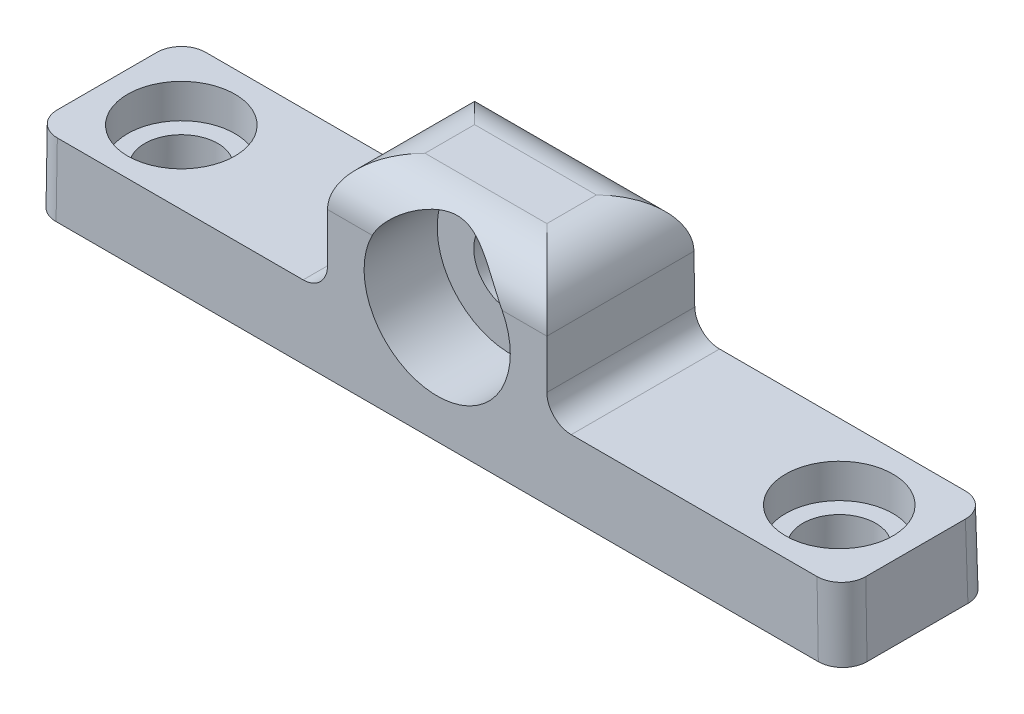
ISO-10303-21;
HEADER;
FILE_DESCRIPTION(('STEP AP214'),'2;1');
FILE_NAME('part.step','',(''),(''),'','','');
FILE_SCHEMA(('AUTOMOTIVE_DESIGN { 1 0 10303 214 1 1 1 1 }'));
ENDSEC;
DATA;
#1=APPLICATION_CONTEXT('core data for automotive mechanical design processes');
#2=APPLICATION_PROTOCOL_DEFINITION('international standard','automotive_design',2000,#1);
#3=PRODUCT_CONTEXT('',#1,'mechanical');
#4=PRODUCT('Part','Part','',(#3));
#5=PRODUCT_RELATED_PRODUCT_CATEGORY('part','',(#4));
#6=PRODUCT_DEFINITION_FORMATION('','',#4);
#7=PRODUCT_DEFINITION_CONTEXT('part definition',#1,'design');
#8=PRODUCT_DEFINITION('design','',#6,#7);
#9=PRODUCT_DEFINITION_SHAPE('','',#8);
#10=(LENGTH_UNIT() NAMED_UNIT(*) SI_UNIT(.MILLI.,.METRE.));
#11=(NAMED_UNIT(*) PLANE_ANGLE_UNIT() SI_UNIT($,.RADIAN.));
#12=(NAMED_UNIT(*) SI_UNIT($,.STERADIAN.) SOLID_ANGLE_UNIT());
#13=UNCERTAINTY_MEASURE_WITH_UNIT(LENGTH_MEASURE(1.E-05),#10,'distance_accuracy_value','');
#14=(GEOMETRIC_REPRESENTATION_CONTEXT(3) GLOBAL_UNCERTAINTY_ASSIGNED_CONTEXT((#13)) GLOBAL_UNIT_ASSIGNED_CONTEXT((#10,
#11,#12)) REPRESENTATION_CONTEXT('',''));
#15=CARTESIAN_POINT('',(0.,0.,0.));
#16=DIRECTION('',(0.,0.,1.));
#17=DIRECTION('',(1.,0.,0.));
#18=AXIS2_PLACEMENT_3D('',#15,#16,#17);
#19=CARTESIAN_POINT('',(0.,4.62121277669627,-7.));
#20=DIRECTION('',(0.,0.,1.));
#21=DIRECTION('',(1.,0.,0.));
#22=AXIS2_PLACEMENT_3D('',#19,#20,#21);
#23=CYLINDRICAL_SURFACE('',#22,1.5);
#24=CARTESIAN_POINT('',(0.,4.62121277669627,-3.0589769503614));
#25=DIRECTION('',(0.,0.0174524064372835,-0.999847695156391));
#26=DIRECTION('',(0.,0.999847695156391,0.0174524064372835));
#27=AXIS2_PLACEMENT_3D('',#24,#25,#26);
#28=ELLIPSE('',#27,1.50022849206586,1.5);
#29=CARTESIAN_POINT('',(-0.5014726581241,6.03490481287457,-3.0343008640814));
#30=VERTEX_POINT('',#29);
#31=CARTESIAN_POINT('',(0.5014726581241,6.03490481287457,-3.0343008640814));
#32=VERTEX_POINT('',#31);
#33=EDGE_CURVE('E360',#30,#32,#28,.F.);
#34=ORIENTED_EDGE('',*,*,#33,.F.);
#35=CARTESIAN_POINT('',(-0.5014726581241,6.03490481287457,-3.0343008640814));
#36=CARTESIAN_POINT('',(-0.461164265254523,6.04920095553008,-3.03404528329319));
#37=CARTESIAN_POINT('',(-0.420271796739823,6.06176620366664,-3.03367976185432));
#38=CARTESIAN_POINT('',(-0.337567583997696,6.08336144818534,-3.03289756463463));
#39=CARTESIAN_POINT('',(-0.295755907784368,6.09239170520525,-3.03248089262815));
#40=CARTESIAN_POINT('',(-0.17173174168321,6.11365672825138,-3.03142770117953));
#41=CARTESIAN_POINT('',(-0.0885813533782081,6.12089072350346,-3.03095408277586));
#42=CARTESIAN_POINT('',(0.0369466070165139,6.12136208179042,-3.03091704853926));
#43=CARTESIAN_POINT('',(0.0793856295369398,6.11971287958541,-3.03102186796923));
#44=CARTESIAN_POINT('',(0.163988208428178,6.11282457380175,-3.0314241507429));
#45=CARTESIAN_POINT('',(0.206151744371378,6.1075852069912,-3.03172162821225));
#46=CARTESIAN_POINT('',(0.291106756026571,6.09334259413348,-3.0324396533123));
#47=CARTESIAN_POINT('',(0.333880372938298,6.08423345104407,-3.03286355498025));
#48=CARTESIAN_POINT('',(0.4184731302681,6.06232092293021,-3.03366171832476));
#49=CARTESIAN_POINT('',(0.460292225587921,6.04951736374406,-3.03403597765987));
#50=CARTESIAN_POINT('',(0.5014726581241,6.03490481287457,-3.0343008640814));
#51=B_SPLINE_CURVE_WITH_KNOTS('',3,(#35,#36,#37,#38,#39,#40,#41,#42,#43,#44,#45,#46,#47,#48,#49,
#50),.UNSPECIFIED.,.F.,.F.,(4,2,2,2,2,2,2,4),(0.,0.12821411575381,0.256418776395516,
0.505450639660241,0.632746146134555,0.760050986950308,0.891090033193026,1.02213525787159),.UNSPECIFIED.);
#52=EDGE_CURVE('E210',#30,#32,#51,.T.);
#53=ORIENTED_EDGE('',*,*,#52,.T.);
#54=EDGE_LOOP('',(#34,#53));
#55=FACE_BOUND('',#54,.T.);
#56=CARTESIAN_POINT('',(0.,4.62121277669627,0.));
#57=DIRECTION('',(0.,0.,1.));
#58=DIRECTION('',(1.,0.,0.));
#59=AXIS2_PLACEMENT_3D('',#56,#57,#58);
#60=CIRCLE('',#59,1.5);
#61=CARTESIAN_POINT('',(1.5,4.62121277669627,0.));
#62=VERTEX_POINT('',#61);
#63=EDGE_CURVE('E235',#62,#62,#60,.F.);
#64=ORIENTED_EDGE('',*,*,#63,.F.);
#65=EDGE_LOOP('',(#64));
#66=FACE_BOUND('',#65,.T.);
#67=ADVANCED_FACE('F44',(#55,#66),#23,.F.);
#68=CARTESIAN_POINT('',(-16.5872753246411,3.,3.));
#69=DIRECTION('',(-0.999847695156391,0.0174524064372833,0.));
#70=DIRECTION('',(0.0174524064372833,0.999847695156391,0.));
#71=AXIS2_PLACEMENT_3D('',#68,#69,#70);
#72=PLANE('',#71);
#73=DIRECTION('',(0.,0.,1.));
#74=VECTOR('',#73,1.);
#75=CARTESIAN_POINT('',(-16.5872753246411,3.,3.));
#76=LINE('',#75,#74);
#77=CARTESIAN_POINT('',(-16.5872753246411,3.,2.));
#78=VERTEX_POINT('',#77);
#79=CARTESIAN_POINT('',(-16.5872753246411,3.,-2.0874276294847));
#80=VERTEX_POINT('',#79);
#81=EDGE_CURVE('E397',#78,#80,#76,.F.);
#82=ORIENTED_EDGE('',*,*,#81,.T.);
#83=DIRECTION('',(0.0174497491606825,0.999695459881888,0.0174497491606827));
#84=VECTOR('',#83,1.);
#85=CARTESIAN_POINT('',(-16.5857262347458,3.08874730066086,-2.08587853958946));
#86=LINE('',#85,#84);
#87=CARTESIAN_POINT('',(-16.6396405194257,0.,-2.13979282426935));
#88=VERTEX_POINT('',#87);
#89=EDGE_CURVE('E510',#80,#88,#86,.F.);
#90=ORIENTED_EDGE('',*,*,#89,.T.);
#91=DIRECTION('',(0.,0.,1.));
#92=VECTOR('',#91,1.);
#93=CARTESIAN_POINT('',(-16.6396405194257,0.,3.));
#94=LINE('',#93,#92);
#95=CARTESIAN_POINT('',(-16.6396405194257,0.,2.));
#96=VERTEX_POINT('',#95);
#97=EDGE_CURVE('E362',#96,#88,#94,.F.);
#98=ORIENTED_EDGE('',*,*,#97,.F.);
#99=DIRECTION('',(-0.0174524064372833,-0.999847695156391,0.));
#100=VECTOR('',#99,1.);
#101=CARTESIAN_POINT('',(-16.5872753246411,3.,2.));
#102=LINE('',#101,#100);
#103=EDGE_CURVE('E188',#96,#78,#102,.F.);
#104=ORIENTED_EDGE('',*,*,#103,.T.);
#105=EDGE_LOOP('',(#82,#90,#98,#104));
#106=FACE_BOUND('',#105,.T.);
#107=ADVANCED_FACE('F278',(#106),#72,.T.);
#108=CARTESIAN_POINT('',(-16.5,0.,3.));
#109=DIRECTION('',(0.,1.,0.));
#110=DIRECTION('',(-1.,0.,0.));
#111=AXIS2_PLACEMENT_3D('',#108,#109,#110);
#112=PLANE('',#111);
#113=CARTESIAN_POINT('',(-13.5,0.,0.));
#114=DIRECTION('',(0.,1.,0.));
#115=DIRECTION('',(-1.,0.,0.));
#116=AXIS2_PLACEMENT_3D('',#113,#114,#115);
#117=CIRCLE('',#116,1.5);
#118=CARTESIAN_POINT('',(-15.,0.,0.));
#119=VERTEX_POINT('',#118);
#120=EDGE_CURVE('E47',#119,#119,#117,.T.);
#121=ORIENTED_EDGE('',*,*,#120,.T.);
#122=EDGE_LOOP('',(#121));
#123=FACE_BOUND('',#122,.T.);
#124=CARTESIAN_POINT('',(13.5,0.,0.));
#125=DIRECTION('',(0.,1.,0.));
#126=DIRECTION('',(-1.,0.,0.));
#127=AXIS2_PLACEMENT_3D('',#124,#125,#126);
#128=CIRCLE('',#127,1.5);
#129=CARTESIAN_POINT('',(12.,0.,0.));
#130=VERTEX_POINT('',#129);
#131=EDGE_CURVE('E433',#130,#130,#128,.T.);
#132=ORIENTED_EDGE('',*,*,#131,.T.);
#133=EDGE_LOOP('',(#132));
#134=FACE_BOUND('',#133,.T.);
#135=ORIENTED_EDGE('',*,*,#97,.T.);
#136=CARTESIAN_POINT('',(-15.6394881913818,0.,-2.13948819138183));
#137=DIRECTION('',(0.,1.,0.));
#138=DIRECTION('',(-0.707106781186546,0.,-0.707106781186549));
#139=AXIS2_PLACEMENT_3D('',#136,#137,#138);
#140=ELLIPSE('',#139,1.00030463289105,1.);
#141=CARTESIAN_POINT('',(-15.6397928242693,0.,-3.13964051942574));
#142=VERTEX_POINT('',#141);
#143=EDGE_CURVE('E492',#88,#142,#140,.F.);
#144=ORIENTED_EDGE('',*,*,#143,.T.);
#145=DIRECTION('',(-1.,0.,0.));
#146=VECTOR('',#145,1.);
#147=CARTESIAN_POINT('',(-16.5,0.,-3.13964051942574));
#148=LINE('',#147,#146);
#149=CARTESIAN_POINT('',(15.6397928242694,0.,-3.13964051942574));
#150=VERTEX_POINT('',#149);
#151=EDGE_CURVE('E381',#142,#150,#148,.F.);
#152=ORIENTED_EDGE('',*,*,#151,.T.);
#153=CARTESIAN_POINT('',(15.6394881913818,0.,-2.13948819138183));
#154=DIRECTION('',(0.,1.,0.));
#155=DIRECTION('',(-0.707106781186548,0.,0.707106781186547));
#156=AXIS2_PLACEMENT_3D('',#153,#154,#155);
#157=ELLIPSE('',#156,1.00030463289105,1.);
#158=CARTESIAN_POINT('',(16.6396405194257,0.,-2.13979282426935));
#159=VERTEX_POINT('',#158);
#160=EDGE_CURVE('E498',#150,#159,#157,.F.);
#161=ORIENTED_EDGE('',*,*,#160,.T.);
#162=DIRECTION('',(0.,0.,1.));
#163=VECTOR('',#162,1.);
#164=CARTESIAN_POINT('',(16.6396405194257,0.,3.));
#165=LINE('',#164,#163);
#166=CARTESIAN_POINT('',(16.6396405194257,0.,2.));
#167=VERTEX_POINT('',#166);
#168=EDGE_CURVE('E369',#167,#159,#165,.F.);
#169=ORIENTED_EDGE('',*,*,#168,.F.);
#170=CARTESIAN_POINT('',(15.6394881913818,0.,2.));
#171=DIRECTION('',(0.,1.,0.));
#172=DIRECTION('',(-1.,0.,0.));
#173=AXIS2_PLACEMENT_3D('',#170,#171,#172);
#174=ELLIPSE('',#173,1.00015232804391,1.);
#175=CARTESIAN_POINT('',(15.6394881913818,0.,3.));
#176=VERTEX_POINT('',#175);
#177=EDGE_CURVE('E501',#167,#176,#174,.F.);
#178=ORIENTED_EDGE('',*,*,#177,.T.);
#179=DIRECTION('',(1.,0.,0.));
#180=VECTOR('',#179,1.);
#181=CARTESIAN_POINT('',(-16.5,0.,3.));
#182=LINE('',#181,#180);
#183=CARTESIAN_POINT('',(-15.6394881913818,0.,3.));
#184=VERTEX_POINT('',#183);
#185=EDGE_CURVE('E380',#184,#176,#182,.T.);
#186=ORIENTED_EDGE('',*,*,#185,.F.);
#187=CARTESIAN_POINT('',(-15.6394881913818,0.,2.));
#188=DIRECTION('',(0.,1.,0.));
#189=DIRECTION('',(-1.,0.,0.));
#190=AXIS2_PLACEMENT_3D('',#187,#188,#189);
#191=ELLIPSE('',#190,1.00015232804391,1.);
#192=EDGE_CURVE('E502',#184,#96,#191,.F.);
#193=ORIENTED_EDGE('',*,*,#192,.T.);
#194=EDGE_LOOP('',(#135,#144,#152,#161,#169,#178,#186,#193));
#195=FACE_BOUND('',#194,.T.);
#196=ADVANCED_FACE('F303',(#123,#134,#195),#112,.F.);
#197=CARTESIAN_POINT('',(16.5,8.00000000000001,3.));
#198=DIRECTION('',(0.999847695156391,0.0174524064372837,0.));
#199=DIRECTION('',(-0.0174524064372837,0.999847695156391,0.));
#200=AXIS2_PLACEMENT_3D('',#197,#198,#199);
#201=PLANE('',#200);
#202=ORIENTED_EDGE('',*,*,#168,.T.);
#203=DIRECTION('',(0.0174497491606829,-0.999695459881888,-0.0174497491606827));
#204=VECTOR('',#203,1.);
#205=CARTESIAN_POINT('',(16.4984774848953,8.08722483193201,-1.99862978973888));
#206=LINE('',#205,#204);
#207=CARTESIAN_POINT('',(16.5872753246411,3.00000000000001,-2.0874276294847));
#208=VERTEX_POINT('',#207);
#209=EDGE_CURVE('E472',#159,#208,#206,.F.);
#210=ORIENTED_EDGE('',*,*,#209,.T.);
#211=DIRECTION('',(0.,0.,1.));
#212=VECTOR('',#211,1.);
#213=CARTESIAN_POINT('',(16.5872753246411,3.00000000000001,3.));
#214=LINE('',#213,#212);
#215=CARTESIAN_POINT('',(16.5872753246411,3.00000000000001,2.));
#216=VERTEX_POINT('',#215);
#217=EDGE_CURVE('E516',#216,#208,#214,.F.);
#218=ORIENTED_EDGE('',*,*,#217,.F.);
#219=DIRECTION('',(-0.0174524064372837,0.999847695156391,0.));
#220=VECTOR('',#219,1.);
#221=CARTESIAN_POINT('',(16.6396405194257,0.,2.));
#222=LINE('',#221,#220);
#223=EDGE_CURVE('E478',#216,#167,#222,.F.);
#224=ORIENTED_EDGE('',*,*,#223,.T.);
#225=EDGE_LOOP('',(#202,#210,#218,#224));
#226=FACE_BOUND('',#225,.T.);
#227=ADVANCED_FACE('F301',(#226),#201,.T.);
#228=CARTESIAN_POINT('',(16.5,3.00000000000001,3.));
#229=DIRECTION('',(0.,-1.,0.));
#230=DIRECTION('',(1.,0.,0.));
#231=AXIS2_PLACEMENT_3D('',#228,#229,#230);
#232=PLANE('',#231);
#233=CARTESIAN_POINT('',(13.5,3.,0.));
#234=DIRECTION('',(0.,1.,0.));
#235=DIRECTION('',(0.,0.,1.));
#236=AXIS2_PLACEMENT_3D('',#233,#234,#235);
#237=CIRCLE('',#236,2.2);
#238=CARTESIAN_POINT('',(13.5,3.,2.2));
#239=VERTEX_POINT('',#238);
#240=EDGE_CURVE('E416',#239,#239,#237,.T.);
#241=ORIENTED_EDGE('',*,*,#240,.F.);
#242=EDGE_LOOP('',(#241));
#243=FACE_BOUND('',#242,.T.);
#244=ORIENTED_EDGE('',*,*,#217,.T.);
#245=CARTESIAN_POINT('',(15.5871229965972,3.00000000000001,-2.08712299659718));
#246=DIRECTION('',(0.,-1.,0.));
#247=DIRECTION('',(-0.707106781186546,0.,0.707106781186549));
#248=AXIS2_PLACEMENT_3D('',#245,#246,#247);
#249=ELLIPSE('',#248,1.00030463289105,1.);
#250=CARTESIAN_POINT('',(15.5874276294847,3.00000000000001,-3.08727532464109));
#251=VERTEX_POINT('',#250);
#252=EDGE_CURVE('E462',#208,#251,#249,.F.);
#253=ORIENTED_EDGE('',*,*,#252,.T.);
#254=DIRECTION('',(1.,0.,0.));
#255=VECTOR('',#254,1.);
#256=CARTESIAN_POINT('',(16.5,3.00000000000001,-3.08727532464109));
#257=LINE('',#256,#255);
#258=CARTESIAN_POINT('',(5.5,3.,-3.08727532464109));
#259=VERTEX_POINT('',#258);
#260=EDGE_CURVE('E384',#251,#259,#257,.F.);
#261=ORIENTED_EDGE('',*,*,#260,.T.);
#262=DIRECTION('',(0.,0.,-1.));
#263=VECTOR('',#262,1.);
#264=CARTESIAN_POINT('',(5.5,3.,3.));
#265=LINE('',#264,#263);
#266=CARTESIAN_POINT('',(5.5,3.,3.));
#267=VERTEX_POINT('',#266);
#268=EDGE_CURVE('E469',#259,#267,#265,.F.);
#269=ORIENTED_EDGE('',*,*,#268,.T.);
#270=DIRECTION('',(-1.,0.,0.));
#271=VECTOR('',#270,1.);
#272=CARTESIAN_POINT('',(16.5,3.00000000000001,3.));
#273=LINE('',#272,#271);
#274=CARTESIAN_POINT('',(15.5871229965972,3.00000000000001,3.));
#275=VERTEX_POINT('',#274);
#276=EDGE_CURVE('E404',#275,#267,#273,.T.);
#277=ORIENTED_EDGE('',*,*,#276,.F.);
#278=CARTESIAN_POINT('',(15.5871229965972,3.00000000000001,2.));
#279=DIRECTION('',(0.,-1.,0.));
#280=DIRECTION('',(-1.,0.,0.));
#281=AXIS2_PLACEMENT_3D('',#278,#279,#280);
#282=ELLIPSE('',#281,1.00015232804391,1.);
#283=EDGE_CURVE('E467',#275,#216,#282,.F.);
#284=ORIENTED_EDGE('',*,*,#283,.T.);
#285=EDGE_LOOP('',(#244,#253,#261,#269,#277,#284));
#286=FACE_BOUND('',#285,.T.);
#287=ADVANCED_FACE('F300',(#243,#286),#232,.F.);
#288=CARTESIAN_POINT('',(4.5,3.,3.));
#289=DIRECTION('',(-1.,0.,0.));
#290=DIRECTION('',(0.,-1.,0.));
#291=AXIS2_PLACEMENT_3D('',#288,#289,#290);
#292=PLANE('',#291);
#293=DIRECTION('',(0.,1.,0.));
#294=VECTOR('',#293,1.);
#295=CARTESIAN_POINT('',(4.5,3.,3.));
#296=LINE('',#295,#294);
#297=CARTESIAN_POINT('',(4.5,4.,3.));
#298=VERTEX_POINT('',#297);
#299=CARTESIAN_POINT('',(4.5,6.,3.));
#300=VERTEX_POINT('',#299);
#301=EDGE_CURVE('E331',#298,#300,#296,.T.);
#302=ORIENTED_EDGE('',*,*,#301,.F.);
#303=DIRECTION('',(0.,0.,-1.));
#304=VECTOR('',#303,1.);
#305=CARTESIAN_POINT('',(4.5,4.,-3.08727532464109));
#306=LINE('',#305,#304);
#307=CARTESIAN_POINT('',(4.5,4.,-3.06982025971287));
#308=VERTEX_POINT('',#307);
#309=EDGE_CURVE('E452',#298,#308,#306,.T.);
#310=ORIENTED_EDGE('',*,*,#309,.T.);
#311=DIRECTION('',(0.,-0.999847695156391,-0.0174524064372835));
#312=VECTOR('',#311,1.);
#313=CARTESIAN_POINT('',(4.5,3.10622142255977,-3.08542122281354));
#314=LINE('',#313,#312);
#315=CARTESIAN_POINT('',(4.5,6.,-3.03491012985643));
#316=VERTEX_POINT('',#315);
#317=EDGE_CURVE('E333',#308,#316,#314,.F.);
#318=ORIENTED_EDGE('',*,*,#317,.T.);
#319=DIRECTION('',(0.,0.,-1.));
#320=VECTOR('',#319,1.);
#321=CARTESIAN_POINT('',(4.5,6.,3.));
#322=LINE('',#321,#320);
#323=EDGE_CURVE('E211',#316,#300,#322,.F.);
#324=ORIENTED_EDGE('',*,*,#323,.T.);
#325=EDGE_LOOP('',(#302,#310,#318,#324));
#326=FACE_BOUND('',#325,.T.);
#327=ADVANCED_FACE('F291',(#326),#292,.F.);
#328=CARTESIAN_POINT('',(4.5,8.,3.));
#329=DIRECTION('',(0.,-1.,0.));
#330=DIRECTION('',(1.,0.,0.));
#331=AXIS2_PLACEMENT_3D('',#328,#329,#330);
#332=PLANE('',#331);
#333=DIRECTION('',(-1.,0.,0.));
#334=VECTOR('',#333,1.);
#335=CARTESIAN_POINT('',(4.5,8.,1.));
#336=LINE('',#335,#334);
#337=CARTESIAN_POINT('',(-2.5,8.,1.));
#338=VERTEX_POINT('',#337);
#339=CARTESIAN_POINT('',(2.5,8.,1.));
#340=VERTEX_POINT('',#339);
#341=EDGE_CURVE('E334',#338,#340,#336,.F.);
#342=ORIENTED_EDGE('',*,*,#341,.T.);
#343=DIRECTION('',(0.,0.,-1.));
#344=VECTOR('',#343,1.);
#345=CARTESIAN_POINT('',(2.5,8.,3.));
#346=LINE('',#345,#344);
#347=CARTESIAN_POINT('',(2.5,8.,-1.03460547376862));
#348=VERTEX_POINT('',#347);
#349=EDGE_CURVE('E337',#340,#348,#346,.T.);
#350=ORIENTED_EDGE('',*,*,#349,.T.);
#351=DIRECTION('',(1.,0.,0.));
#352=VECTOR('',#351,1.);
#353=CARTESIAN_POINT('',(4.5,8.,-1.03460547376862));
#354=LINE('',#353,#352);
#355=CARTESIAN_POINT('',(-2.5,8.,-1.03460547376862));
#356=VERTEX_POINT('',#355);
#357=EDGE_CURVE('E341',#348,#356,#354,.F.);
#358=ORIENTED_EDGE('',*,*,#357,.T.);
#359=DIRECTION('',(0.,0.,-1.));
#360=VECTOR('',#359,1.);
#361=CARTESIAN_POINT('',(-2.5,8.,3.));
#362=LINE('',#361,#360);
#363=EDGE_CURVE('E361',#356,#338,#362,.F.);
#364=ORIENTED_EDGE('',*,*,#363,.T.);
#365=EDGE_LOOP('',(#342,#350,#358,#364));
#366=FACE_BOUND('',#365,.T.);
#367=ADVANCED_FACE('F289',(#366),#332,.F.);
#368=CARTESIAN_POINT('',(-4.5,8.,3.));
#369=DIRECTION('',(1.,0.,0.));
#370=DIRECTION('',(0.,1.,0.));
#371=AXIS2_PLACEMENT_3D('',#368,#369,#370);
#372=PLANE('',#371);
#373=DIRECTION('',(0.,0.999847695156391,0.0174524064372835));
#374=VECTOR('',#373,1.);
#375=CARTESIAN_POINT('',(-4.5,8.10469849010751,-2.99817248105729));
#376=LINE('',#375,#374);
#377=CARTESIAN_POINT('',(-4.5,6.,-3.03491012985643));
#378=VERTEX_POINT('',#377);
#379=CARTESIAN_POINT('',(-4.5,4.,-3.06982025971287));
#380=VERTEX_POINT('',#379);
#381=EDGE_CURVE('E377',#378,#380,#376,.F.);
#382=ORIENTED_EDGE('',*,*,#381,.T.);
#383=DIRECTION('',(0.,0.,-1.));
#384=VECTOR('',#383,1.);
#385=CARTESIAN_POINT('',(-4.5,4.,3.));
#386=LINE('',#385,#384);
#387=CARTESIAN_POINT('',(-4.5,4.,3.));
#388=VERTEX_POINT('',#387);
#389=EDGE_CURVE('E71',#380,#388,#386,.F.);
#390=ORIENTED_EDGE('',*,*,#389,.T.);
#391=DIRECTION('',(0.,-1.,0.));
#392=VECTOR('',#391,1.);
#393=CARTESIAN_POINT('',(-4.5,8.,3.));
#394=LINE('',#393,#392);
#395=CARTESIAN_POINT('',(-4.5,6.,3.));
#396=VERTEX_POINT('',#395);
#397=EDGE_CURVE('E398',#396,#388,#394,.T.);
#398=ORIENTED_EDGE('',*,*,#397,.F.);
#399=DIRECTION('',(0.,0.,-1.));
#400=VECTOR('',#399,1.);
#401=CARTESIAN_POINT('',(-4.5,6.,3.));
#402=LINE('',#401,#400);
#403=EDGE_CURVE('E191',#396,#378,#402,.T.);
#404=ORIENTED_EDGE('',*,*,#403,.T.);
#405=EDGE_LOOP('',(#382,#390,#398,#404));
#406=FACE_BOUND('',#405,.T.);
#407=ADVANCED_FACE('F286',(#406),#372,.F.);
#408=CARTESIAN_POINT('',(-4.5,3.,3.));
#409=DIRECTION('',(0.,-1.,0.));
#410=DIRECTION('',(1.,0.,0.));
#411=AXIS2_PLACEMENT_3D('',#408,#409,#410);
#412=PLANE('',#411);
#413=CARTESIAN_POINT('',(-13.5,3.,0.));
#414=DIRECTION('',(0.,1.,0.));
#415=DIRECTION('',(0.,0.,1.));
#416=AXIS2_PLACEMENT_3D('',#413,#414,#415);
#417=CIRCLE('',#416,2.2);
#418=CARTESIAN_POINT('',(-13.5,3.,2.2));
#419=VERTEX_POINT('',#418);
#420=EDGE_CURVE('E390',#419,#419,#417,.T.);
#421=ORIENTED_EDGE('',*,*,#420,.F.);
#422=EDGE_LOOP('',(#421));
#423=FACE_BOUND('',#422,.T.);
#424=DIRECTION('',(1.,0.,0.));
#425=VECTOR('',#424,1.);
#426=CARTESIAN_POINT('',(-4.5,3.,-3.08727532464109));
#427=LINE('',#426,#425);
#428=CARTESIAN_POINT('',(-5.5,3.,-3.08727532464109));
#429=VERTEX_POINT('',#428);
#430=CARTESIAN_POINT('',(-15.5874276294847,3.,-3.08727532464109));
#431=VERTEX_POINT('',#430);
#432=EDGE_CURVE('E373',#429,#431,#427,.F.);
#433=ORIENTED_EDGE('',*,*,#432,.T.);
#434=CARTESIAN_POINT('',(-15.5871229965972,3.,-2.08712299659718));
#435=DIRECTION('',(0.,-1.,0.));
#436=DIRECTION('',(-0.707106781186545,0.,-0.707106781186551));
#437=AXIS2_PLACEMENT_3D('',#434,#435,#436);
#438=ELLIPSE('',#437,1.00030463289105,1.);
#439=EDGE_CURVE('E480',#431,#80,#438,.F.);
#440=ORIENTED_EDGE('',*,*,#439,.T.);
#441=ORIENTED_EDGE('',*,*,#81,.F.);
#442=CARTESIAN_POINT('',(-15.5871229965972,3.,2.));
#443=DIRECTION('',(0.,-1.,0.));
#444=DIRECTION('',(-1.,0.,0.));
#445=AXIS2_PLACEMENT_3D('',#442,#443,#444);
#446=ELLIPSE('',#445,1.00015232804391,1.);
#447=CARTESIAN_POINT('',(-15.5871229965972,3.,3.));
#448=VERTEX_POINT('',#447);
#449=EDGE_CURVE('E485',#78,#448,#446,.F.);
#450=ORIENTED_EDGE('',*,*,#449,.T.);
#451=DIRECTION('',(-1.,0.,0.));
#452=VECTOR('',#451,1.);
#453=CARTESIAN_POINT('',(-4.5,3.,3.));
#454=LINE('',#453,#452);
#455=CARTESIAN_POINT('',(-5.5,3.,3.));
#456=VERTEX_POINT('',#455);
#457=EDGE_CURVE('E395',#456,#448,#454,.T.);
#458=ORIENTED_EDGE('',*,*,#457,.F.);
#459=DIRECTION('',(0.,0.,-1.));
#460=VECTOR('',#459,1.);
#461=CARTESIAN_POINT('',(-5.5,3.,-3.08727532464109));
#462=LINE('',#461,#460);
#463=EDGE_CURVE('E484',#456,#429,#462,.T.);
#464=ORIENTED_EDGE('',*,*,#463,.T.);
#465=EDGE_LOOP('',(#433,#440,#441,#450,#458,#464));
#466=FACE_BOUND('',#465,.T.);
#467=ADVANCED_FACE('F282',(#423,#466),#412,.F.);
#468=CARTESIAN_POINT('',(0.,0.,3.));
#469=DIRECTION('',(0.,0.,1.));
#470=DIRECTION('',(1.,0.,0.));
#471=AXIS2_PLACEMENT_3D('',#468,#469,#470);
#472=PLANE('',#471);
#473=ORIENTED_EDGE('',*,*,#185,.T.);
#474=DIRECTION('',(0.0174524064372837,-0.999847695156391,0.));
#475=VECTOR('',#474,1.);
#476=CARTESIAN_POINT('',(15.5874276294847,2.98254759356272,3.));
#477=LINE('',#476,#475);
#478=EDGE_CURVE('E455',#176,#275,#477,.F.);
#479=ORIENTED_EDGE('',*,*,#478,.T.);
#480=ORIENTED_EDGE('',*,*,#276,.T.);
#481=CARTESIAN_POINT('',(5.5,4.,3.));
#482=DIRECTION('',(0.,0.,1.));
#483=DIRECTION('',(1.,0.,0.));
#484=AXIS2_PLACEMENT_3D('',#481,#482,#483);
#485=CIRCLE('',#484,1.);
#486=EDGE_CURVE('E64',#267,#298,#485,.F.);
#487=ORIENTED_EDGE('',*,*,#486,.T.);
#488=ORIENTED_EDGE('',*,*,#301,.T.);
#489=DIRECTION('',(-1.,0.,0.));
#490=VECTOR('',#489,1.);
#491=CARTESIAN_POINT('',(-4.5,6.,3.));
#492=LINE('',#491,#490);
#493=CARTESIAN_POINT('',(2.6643846931054,6.,3.));
#494=VERTEX_POINT('',#493);
#495=EDGE_CURVE('E198',#300,#494,#492,.T.);
#496=ORIENTED_EDGE('',*,*,#495,.T.);
#497=CARTESIAN_POINT('',(0.,4.62121277669627,3.));
#498=DIRECTION('',(0.,0.,1.));
#499=DIRECTION('',(1.,0.,0.));
#500=AXIS2_PLACEMENT_3D('',#497,#498,#499);
#501=CIRCLE('',#500,3.);
#502=CARTESIAN_POINT('',(-2.6643846931054,6.,3.));
#503=VERTEX_POINT('',#502);
#504=EDGE_CURVE('E183',#503,#494,#501,.T.);
#505=ORIENTED_EDGE('',*,*,#504,.F.);
#506=DIRECTION('',(-1.,0.,0.));
#507=VECTOR('',#506,1.);
#508=CARTESIAN_POINT('',(-4.5,6.,3.));
#509=LINE('',#508,#507);
#510=EDGE_CURVE('E195',#503,#396,#509,.T.);
#511=ORIENTED_EDGE('',*,*,#510,.T.);
#512=ORIENTED_EDGE('',*,*,#397,.T.);
#513=CARTESIAN_POINT('',(-5.5,4.,3.));
#514=DIRECTION('',(0.,0.,1.));
#515=DIRECTION('',(1.,0.,0.));
#516=AXIS2_PLACEMENT_3D('',#513,#514,#515);
#517=CIRCLE('',#516,1.);
#518=EDGE_CURVE('E11',#388,#456,#517,.F.);
#519=ORIENTED_EDGE('',*,*,#518,.T.);
#520=ORIENTED_EDGE('',*,*,#457,.T.);
#521=DIRECTION('',(0.0174524064372833,0.999847695156391,0.));
#522=VECTOR('',#521,1.);
#523=CARTESIAN_POINT('',(-15.6397928242693,-0.0174524064372833,3.));
#524=LINE('',#523,#522);
#525=EDGE_CURVE('E460',#448,#184,#524,.F.);
#526=ORIENTED_EDGE('',*,*,#525,.T.);
#527=EDGE_LOOP('',(#473,#479,#480,#487,#488,#496,#505,#511,#512,#519,#520,#526));
#528=FACE_BOUND('',#527,.T.);
#529=ADVANCED_FACE('F193',(#528),#472,.T.);
#530=CARTESIAN_POINT('',(16.5,3.00000000000001,-3.08727532464109));
#531=DIRECTION('',(0.,0.0174524064372835,-0.999847695156391));
#532=DIRECTION('',(0.,0.999847695156391,0.0174524064372835));
#533=AXIS2_PLACEMENT_3D('',#530,#531,#532);
#534=PLANE('',#533);
#535=ORIENTED_EDGE('',*,*,#151,.F.);
#536=DIRECTION('',(0.0174497491606825,0.999695459881888,0.0174497491606827));
#537=VECTOR('',#536,1.);
#538=CARTESIAN_POINT('',(-15.5776572084536,3.55974704598519,-3.07750490361004));
#539=LINE('',#538,#537);
#540=EDGE_CURVE('E490',#142,#431,#539,.T.);
#541=ORIENTED_EDGE('',*,*,#540,.T.);
#542=ORIENTED_EDGE('',*,*,#432,.F.);
#543=CARTESIAN_POINT('',(-5.5,4.,-3.06982025971287));
#544=DIRECTION('',(0.,0.0174524064372835,-0.999847695156391));
#545=DIRECTION('',(0.,0.999847695156391,0.0174524064372835));
#546=AXIS2_PLACEMENT_3D('',#543,#544,#545);
#547=ELLIPSE('',#546,1.00015232804391,1.);
#548=EDGE_CURVE('E54',#429,#380,#547,.F.);
#549=ORIENTED_EDGE('',*,*,#548,.T.);
#550=ORIENTED_EDGE('',*,*,#381,.F.);
#551=CARTESIAN_POINT('',(-2.5,6.,-3.03491012985643));
#552=DIRECTION('',(0.,0.0174524064372835,-0.999847695156391));
#553=DIRECTION('',(0.,-0.999847695156391,-0.0174524064372835));
#554=AXIS2_PLACEMENT_3D('',#551,#552,#553);
#555=ELLIPSE('',#554,2.00030465608782,2.);
#556=CARTESIAN_POINT('',(-4.49969539031278,6.03490481287457,-3.0343008640814));
#557=VERTEX_POINT('',#556);
#558=EDGE_CURVE('E338',#378,#557,#555,.T.);
#559=ORIENTED_EDGE('',*,*,#558,.T.);
#560=DIRECTION('',(-1.,0.,0.));
#561=VECTOR('',#560,1.);
#562=CARTESIAN_POINT('',(16.5,6.03490481287457,-3.0343008640814));
#563=LINE('',#562,#561);
#564=EDGE_CURVE('E345',#557,#30,#563,.F.);
#565=ORIENTED_EDGE('',*,*,#564,.T.);
#566=ORIENTED_EDGE('',*,*,#33,.T.);
#567=DIRECTION('',(-1.,0.,0.));
#568=VECTOR('',#567,1.);
#569=CARTESIAN_POINT('',(16.5,6.03490481287457,-3.0343008640814));
#570=LINE('',#569,#568);
#571=CARTESIAN_POINT('',(4.49969539031278,6.03490481287457,-3.0343008640814));
#572=VERTEX_POINT('',#571);
#573=EDGE_CURVE('E214',#32,#572,#570,.F.);
#574=ORIENTED_EDGE('',*,*,#573,.T.);
#575=CARTESIAN_POINT('',(2.5,6.,-3.03491012985643));
#576=DIRECTION('',(0.,0.0174524064372835,-0.999847695156391));
#577=DIRECTION('',(0.,-0.999847695156391,-0.0174524064372835));
#578=AXIS2_PLACEMENT_3D('',#575,#576,#577);
#579=ELLIPSE('',#578,2.00030465608782,2.);
#580=EDGE_CURVE('E329',#572,#316,#579,.T.);
#581=ORIENTED_EDGE('',*,*,#580,.T.);
#582=ORIENTED_EDGE('',*,*,#317,.F.);
#583=CARTESIAN_POINT('',(5.5,4.,-3.06982025971287));
#584=DIRECTION('',(0.,0.0174524064372835,-0.999847695156391));
#585=DIRECTION('',(0.,0.999847695156391,0.0174524064372835));
#586=AXIS2_PLACEMENT_3D('',#583,#584,#585);
#587=ELLIPSE('',#586,1.00015232804391,1.);
#588=EDGE_CURVE('E450',#308,#259,#587,.F.);
#589=ORIENTED_EDGE('',*,*,#588,.T.);
#590=ORIENTED_EDGE('',*,*,#260,.F.);
#591=DIRECTION('',(0.0174497491606829,-0.999695459881888,-0.0174497491606827));
#592=VECTOR('',#591,1.);
#593=CARTESIAN_POINT('',(15.5877055020641,2.98408069058879,-3.08755319722047));
#594=LINE('',#593,#592);
#595=EDGE_CURVE('E495',#251,#150,#594,.T.);
#596=ORIENTED_EDGE('',*,*,#595,.T.);
#597=EDGE_LOOP('',(#535,#541,#542,#549,#550,#559,#565,#566,#574,#581,#582,#589,#590,#596));
#598=FACE_BOUND('',#597,.T.);
#599=ADVANCED_FACE('F274',(#598),#534,.T.);
#600=CARTESIAN_POINT('',(-13.5,3.,0.));
#601=DIRECTION('',(0.,1.,0.));
#602=DIRECTION('',(0.,0.,1.));
#603=AXIS2_PLACEMENT_3D('',#600,#601,#602);
#604=CYLINDRICAL_SURFACE('',#603,2.2);
#605=CARTESIAN_POINT('',(-13.5,1.6,0.));
#606=DIRECTION('',(0.,1.,0.));
#607=DIRECTION('',(0.,0.,1.));
#608=AXIS2_PLACEMENT_3D('',#605,#606,#607);
#609=CIRCLE('',#608,2.2);
#610=CARTESIAN_POINT('',(-13.5,1.6,2.2));
#611=VERTEX_POINT('',#610);
#612=EDGE_CURVE('E414',#611,#611,#609,.T.);
#613=ORIENTED_EDGE('',*,*,#612,.F.);
#614=EDGE_LOOP('',(#613));
#615=FACE_BOUND('',#614,.T.);
#616=ORIENTED_EDGE('',*,*,#420,.T.);
#617=EDGE_LOOP('',(#616));
#618=FACE_BOUND('',#617,.T.);
#619=ADVANCED_FACE('F272',(#615,#618),#604,.F.);
#620=CARTESIAN_POINT('',(-11.3,1.6,0.));
#621=DIRECTION('',(0.,-1.,0.));
#622=DIRECTION('',(0.,0.,-1.));
#623=AXIS2_PLACEMENT_3D('',#620,#621,#622);
#624=PLANE('',#623);
#625=CARTESIAN_POINT('',(-13.5,1.6,0.));
#626=DIRECTION('',(0.,1.,0.));
#627=DIRECTION('',(0.,0.,1.));
#628=AXIS2_PLACEMENT_3D('',#625,#626,#627);
#629=CIRCLE('',#628,1.5);
#630=CARTESIAN_POINT('',(-13.5,1.6,1.5));
#631=VERTEX_POINT('',#630);
#632=EDGE_CURVE('E427',#631,#631,#629,.T.);
#633=ORIENTED_EDGE('',*,*,#632,.F.);
#634=EDGE_LOOP('',(#633));
#635=FACE_BOUND('',#634,.T.);
#636=ORIENTED_EDGE('',*,*,#612,.T.);
#637=EDGE_LOOP('',(#636));
#638=FACE_BOUND('',#637,.T.);
#639=ADVANCED_FACE('F270',(#635,#638),#624,.F.);
#640=CARTESIAN_POINT('',(13.5,3.,0.));
#641=DIRECTION('',(0.,1.,0.));
#642=DIRECTION('',(0.,0.,1.));
#643=AXIS2_PLACEMENT_3D('',#640,#641,#642);
#644=CYLINDRICAL_SURFACE('',#643,2.2);
#645=CARTESIAN_POINT('',(13.5,1.6,0.));
#646=DIRECTION('',(0.,1.,0.));
#647=DIRECTION('',(0.,0.,1.));
#648=AXIS2_PLACEMENT_3D('',#645,#646,#647);
#649=CIRCLE('',#648,2.2);
#650=CARTESIAN_POINT('',(13.5,1.6,2.2));
#651=VERTEX_POINT('',#650);
#652=EDGE_CURVE('E241',#651,#651,#649,.T.);
#653=ORIENTED_EDGE('',*,*,#652,.F.);
#654=EDGE_LOOP('',(#653));
#655=FACE_BOUND('',#654,.T.);
#656=ORIENTED_EDGE('',*,*,#240,.T.);
#657=EDGE_LOOP('',(#656));
#658=FACE_BOUND('',#657,.T.);
#659=ADVANCED_FACE('F262',(#655,#658),#644,.F.);
#660=CARTESIAN_POINT('',(15.7,1.6,0.));
#661=DIRECTION('',(0.,-1.,0.));
#662=DIRECTION('',(0.,0.,-1.));
#663=AXIS2_PLACEMENT_3D('',#660,#661,#662);
#664=PLANE('',#663);
#665=CARTESIAN_POINT('',(13.5,1.6,0.));
#666=DIRECTION('',(0.,1.,0.));
#667=DIRECTION('',(0.,0.,1.));
#668=AXIS2_PLACEMENT_3D('',#665,#666,#667);
#669=CIRCLE('',#668,1.5);
#670=CARTESIAN_POINT('',(13.5,1.6,1.5));
#671=VERTEX_POINT('',#670);
#672=EDGE_CURVE('E428',#671,#671,#669,.T.);
#673=ORIENTED_EDGE('',*,*,#672,.F.);
#674=EDGE_LOOP('',(#673));
#675=FACE_BOUND('',#674,.T.);
#676=ORIENTED_EDGE('',*,*,#652,.T.);
#677=EDGE_LOOP('',(#676));
#678=FACE_BOUND('',#677,.T.);
#679=ADVANCED_FACE('F260',(#675,#678),#664,.F.);
#680=CARTESIAN_POINT('',(0.,6.,1.));
#681=DIRECTION('',(1.,0.,0.));
#682=DIRECTION('',(0.,1.,0.));
#683=AXIS2_PLACEMENT_3D('',#680,#681,#682);
#684=CYLINDRICAL_SURFACE('',#683,2.);
#685=CARTESIAN_POINT('',(2.6643846931054,6.,3.));
#686=CARTESIAN_POINT('',(2.63412435157108,6.05850739303538,3.00000561326002));
#687=CARTESIAN_POINT('',(2.60193459882088,6.11596056446061,2.99743392090937));
#688=CARTESIAN_POINT('',(2.53410342220037,6.22825697857345,2.98772784781012));
#689=CARTESIAN_POINT('',(2.49846832693628,6.28310474059765,2.9806017027182));
#690=CARTESIAN_POINT('',(2.42446013423584,6.38930269830661,2.96247685808909));
#691=CARTESIAN_POINT('',(2.3861223019923,6.44068526962037,2.95152257268506));
#692=CARTESIAN_POINT('',(2.30666998081094,6.54041659962377,2.92629113150335));
#693=CARTESIAN_POINT('',(2.26555396729371,6.58876366398357,2.91201214054468));
#694=CARTESIAN_POINT('',(2.11492267197688,6.75500617088234,2.8562981015939));
#695=CARTESIAN_POINT('',(1.9984564016781,6.86415807782594,2.80715953557675));
#696=CARTESIAN_POINT('',(1.75216598612867,7.06151786053333,2.69880290918833));
#697=CARTESIAN_POINT('',(1.6222603717724,7.14958581193807,2.63952175598833));
#698=CARTESIAN_POINT('',(1.41700586908015,7.2666827250862,2.54856545879429));
#699=CARTESIAN_POINT('',(1.34579803484981,7.30361354200478,2.51746422943742));
#700=CARTESIAN_POINT('',(1.20030452766738,7.37180030021825,2.45611287182998));
#701=CARTESIAN_POINT('',(1.12601787521969,7.40305441824016,2.42586301965626));
#702=CARTESIAN_POINT('',(0.974612665902531,7.45963371335969,2.36788297551563));
#703=CARTESIAN_POINT('',(0.897505995015018,7.48498105629893,2.34014361057958));
#704=CARTESIAN_POINT('',(0.740217469500812,7.52960716414045,2.28897370661556));
#705=CARTESIAN_POINT('',(0.660038229750508,7.54889096610006,2.26553959792312));
#706=CARTESIAN_POINT('',(0.476469001115212,7.58494911235285,2.22023833786381));
#707=CARTESIAN_POINT('',(0.372238282261377,7.59992664355313,2.20018845331726));
#708=CARTESIAN_POINT('',(0.161198410028882,7.61873900284809,2.17472022922037));
#709=CARTESIAN_POINT('',(0.0543982032954905,7.62260806428065,2.16925694132836));
#710=CARTESIAN_POINT('',(-0.158688834051956,7.61891104541258,2.17436287508796));
#711=CARTESIAN_POINT('',(-0.264975042642899,7.61133349704289,2.18494817545342));
#712=CARTESIAN_POINT('',(-0.474211959982451,7.58538487681728,2.21942105782274));
#713=CARTESIAN_POINT('',(-0.577149939172324,7.56697677100956,2.24335426690111));
#714=CARTESIAN_POINT('',(-0.75643564176326,7.52540943298495,2.29381178879224));
#715=CARTESIAN_POINT('',(-0.833728437263437,7.50413226896931,2.31866287277716));
#716=CARTESIAN_POINT('',(-0.985363495040505,7.4558893302513,2.37174084034766));
#717=CARTESIAN_POINT('',(-1.05970388391609,7.42892001010349,2.39996982314068));
#718=CARTESIAN_POINT('',(-1.20564427306781,7.36942110930543,2.45822663565271));
#719=CARTESIAN_POINT('',(-1.27723624080727,7.33687655491918,2.48825916438499));
#720=CARTESIAN_POINT('',(-1.41754646710606,7.2663461555738,2.5487182022574));
#721=CARTESIAN_POINT('',(-1.48626361423899,7.22835823083051,2.57914485792381));
#722=CARTESIAN_POINT('',(-1.62476805031223,7.14451594259739,2.64102236320562));
#723=CARTESIAN_POINT('',(-1.69437605657494,7.09832816343187,2.67242655120694));
#724=CARTESIAN_POINT('',(-1.83006579596342,6.999847551371,2.73310698581867));
#725=CARTESIAN_POINT('',(-1.89614731904843,6.94755435542112,2.7623831057168));
#726=CARTESIAN_POINT('',(-2.08785627733314,6.78203302288382,2.84486260992299));
#727=CARTESIAN_POINT('',(-2.20801594417905,6.65952403591916,2.8932267988004));
#728=CARTESIAN_POINT('',(-2.38364282467974,6.44574654064073,2.95144854313432));
#729=CARTESIAN_POINT('',(-2.44562451799677,6.36187172478938,2.9689688013032));
#730=CARTESIAN_POINT('',(-2.53245382583229,6.23039471027216,2.98718302360906));
#731=CARTESIAN_POINT('',(-2.56047359125992,6.18543172319318,2.99191261420659));
#732=CARTESIAN_POINT('',(-2.6142106691056,6.0938742737578,2.99832399154643));
#733=CARTESIAN_POINT('',(-2.63992532618539,6.04727801374838,3.00000230523661));
#734=CARTESIAN_POINT('',(-2.6643846931054,6.,3.));
#735=B_SPLINE_CURVE_WITH_KNOTS('',3,(#685,#686,#687,#688,#689,#690,#691,#692,#693,#694,#695,
#696,#697,#698,#699,#700,#701,#702,#703,#704,#705,#706,#707,#708,#709,#710,#711,#712,#713,#714,
#715,#716,#717,#718,#719,#720,#721,#722,#723,#724,#725,#726,#727,#728,#729,#730,#731,#732,#733,
#734),.UNSPECIFIED.,.F.,.F.,(4,2,2,2,2,2,2,2,2,2,2,2,2,2,2,2,2,2,2,2,2,2,2,2,4),(0.,
0.19744929786565,0.394542561417517,0.589421165220817,0.784407594788421,1.28256619812354,
1.78394448452552,2.04184577131018,2.2998297463139,2.55682943032848,2.81361505407355,
3.13383721416205,3.45307147024348,3.77262577124978,4.09327915759808,4.34474776120387,
4.59637346052146,4.84868587600693,5.10109495247914,5.3685110077421,5.63594297282901,
6.16682020556669,6.48307094377241,6.64248906291157,6.80208852305945),.UNSPECIFIED.);
#736=EDGE_CURVE('E179',#494,#503,#735,.T.);
#737=ORIENTED_EDGE('',*,*,#736,.F.);
#738=ORIENTED_EDGE('',*,*,#495,.F.);
#739=CARTESIAN_POINT('',(2.5,6.,1.));
#740=DIRECTION('',(0.707106781186547,0.,-0.707106781186547));
#741=DIRECTION('',(-0.707106781186547,0.,-0.707106781186547));
#742=AXIS2_PLACEMENT_3D('',#739,#740,#741);
#743=ELLIPSE('',#742,2.82842712474619,2.);
#744=EDGE_CURVE('E238',#340,#300,#743,.T.);
#745=ORIENTED_EDGE('',*,*,#744,.F.);
#746=ORIENTED_EDGE('',*,*,#341,.F.);
#747=CARTESIAN_POINT('',(-2.5,6.,1.));
#748=DIRECTION('',(-0.707106781186547,0.,-0.707106781186547));
#749=DIRECTION('',(0.707106781186547,0.,-0.707106781186547));
#750=AXIS2_PLACEMENT_3D('',#747,#748,#749);
#751=ELLIPSE('',#750,2.82842712474619,2.);
#752=EDGE_CURVE('E203',#396,#338,#751,.T.);
#753=ORIENTED_EDGE('',*,*,#752,.F.);
#754=ORIENTED_EDGE('',*,*,#510,.F.);
#755=EDGE_LOOP('',(#737,#738,#745,#746,#753,#754));
#756=FACE_BOUND('',#755,.T.);
#757=ADVANCED_FACE('F201',(#756),#684,.T.);
#758=CARTESIAN_POINT('',(2.5,6.,3.));
#759=DIRECTION('',(0.,0.,-1.));
#760=DIRECTION('',(-1.,0.,0.));
#761=AXIS2_PLACEMENT_3D('',#758,#759,#760);
#762=CYLINDRICAL_SURFACE('',#761,2.);
#763=ORIENTED_EDGE('',*,*,#323,.F.);
#764=ORIENTED_EDGE('',*,*,#580,.F.);
#765=CARTESIAN_POINT('',(2.5,6.,-1.03460547376862));
#766=DIRECTION('',(-0.707106781186547,0.,-0.707106781186547));
#767=DIRECTION('',(0.707106781186547,0.,-0.707106781186547));
#768=AXIS2_PLACEMENT_3D('',#765,#766,#767);
#769=ELLIPSE('',#768,2.82842712474619,2.);
#770=EDGE_CURVE('E233',#348,#572,#769,.T.);
#771=ORIENTED_EDGE('',*,*,#770,.F.);
#772=ORIENTED_EDGE('',*,*,#349,.F.);
#773=ORIENTED_EDGE('',*,*,#744,.T.);
#774=EDGE_LOOP('',(#763,#764,#771,#772,#773));
#775=FACE_BOUND('',#774,.T.);
#776=ADVANCED_FACE('F317',(#775),#762,.T.);
#777=CARTESIAN_POINT('',(-2.5,6.,3.));
#778=DIRECTION('',(0.,0.,-1.));
#779=DIRECTION('',(-1.,0.,0.));
#780=AXIS2_PLACEMENT_3D('',#777,#778,#779);
#781=CYLINDRICAL_SURFACE('',#780,2.);
#782=ORIENTED_EDGE('',*,*,#752,.T.);
#783=ORIENTED_EDGE('',*,*,#363,.F.);
#784=CARTESIAN_POINT('',(-2.5,6.,-1.03460547376862));
#785=DIRECTION('',(0.707106781186547,0.,-0.707106781186547));
#786=DIRECTION('',(-0.707106781186547,0.,-0.707106781186547));
#787=AXIS2_PLACEMENT_3D('',#784,#785,#786);
#788=ELLIPSE('',#787,2.82842712474619,2.);
#789=EDGE_CURVE('E226',#557,#356,#788,.T.);
#790=ORIENTED_EDGE('',*,*,#789,.F.);
#791=ORIENTED_EDGE('',*,*,#558,.F.);
#792=ORIENTED_EDGE('',*,*,#403,.F.);
#793=EDGE_LOOP('',(#782,#783,#790,#791,#792));
#794=FACE_BOUND('',#793,.T.);
#795=ADVANCED_FACE('F312',(#794),#781,.T.);
#796=CARTESIAN_POINT('',(4.5,6.,-1.03460547376862));
#797=DIRECTION('',(1.,0.,0.));
#798=DIRECTION('',(0.,1.,0.));
#799=AXIS2_PLACEMENT_3D('',#796,#797,#798);
#800=CYLINDRICAL_SURFACE('',#799,2.);
#801=ORIENTED_EDGE('',*,*,#52,.F.);
#802=ORIENTED_EDGE('',*,*,#564,.F.);
#803=ORIENTED_EDGE('',*,*,#789,.T.);
#804=ORIENTED_EDGE('',*,*,#357,.F.);
#805=ORIENTED_EDGE('',*,*,#770,.T.);
#806=ORIENTED_EDGE('',*,*,#573,.F.);
#807=EDGE_LOOP('',(#801,#802,#803,#804,#805,#806));
#808=FACE_BOUND('',#807,.T.);
#809=ADVANCED_FACE('F307',(#808),#800,.T.);
#810=CARTESIAN_POINT('',(0.,4.62121277669627,0.));
#811=DIRECTION('',(0.,0.,1.));
#812=DIRECTION('',(1.,0.,0.));
#813=AXIS2_PLACEMENT_3D('',#810,#811,#812);
#814=PLANE('',#813);
#815=CARTESIAN_POINT('',(0.,4.62121277669627,0.));
#816=DIRECTION('',(0.,0.,1.));
#817=DIRECTION('',(1.,0.,0.));
#818=AXIS2_PLACEMENT_3D('',#815,#816,#817);
#819=CIRCLE('',#818,3.);
#820=CARTESIAN_POINT('',(3.,4.62121277669627,0.));
#821=VERTEX_POINT('',#820);
#822=EDGE_CURVE('E197',#821,#821,#819,.T.);
#823=ORIENTED_EDGE('',*,*,#822,.T.);
#824=EDGE_LOOP('',(#823));
#825=FACE_BOUND('',#824,.T.);
#826=ORIENTED_EDGE('',*,*,#63,.T.);
#827=EDGE_LOOP('',(#826));
#828=FACE_BOUND('',#827,.T.);
#829=ADVANCED_FACE('F259',(#825,#828),#814,.T.);
#830=CARTESIAN_POINT('',(0.,4.62121277669627,0.));
#831=DIRECTION('',(0.,0.,1.));
#832=DIRECTION('',(1.,0.,0.));
#833=AXIS2_PLACEMENT_3D('',#830,#831,#832);
#834=CYLINDRICAL_SURFACE('',#833,3.);
#835=ORIENTED_EDGE('',*,*,#736,.T.);
#836=ORIENTED_EDGE('',*,*,#504,.T.);
#837=EDGE_LOOP('',(#835,#836));
#838=FACE_BOUND('',#837,.T.);
#839=ORIENTED_EDGE('',*,*,#822,.F.);
#840=EDGE_LOOP('',(#839));
#841=FACE_BOUND('',#840,.T.);
#842=ADVANCED_FACE('F185',(#838,#841),#834,.F.);
#843=CARTESIAN_POINT('',(-15.5858785395895,3.07129489422358,-2.08587853958946));
#844=DIRECTION('',(-0.0174497491606825,-0.999695459881887,-0.0174497491606827));
#845=DIRECTION('',(0.,0.0174524064372835,-0.999847695156391));
#846=AXIS2_PLACEMENT_3D('',#843,#844,#845);
#847=CYLINDRICAL_SURFACE('',#846,1.);
#848=ORIENTED_EDGE('',*,*,#439,.F.);
#849=ORIENTED_EDGE('',*,*,#540,.F.);
#850=ORIENTED_EDGE('',*,*,#143,.F.);
#851=ORIENTED_EDGE('',*,*,#89,.F.);
#852=EDGE_LOOP('',(#848,#849,#850,#851));
#853=FACE_BOUND('',#852,.T.);
#854=ADVANCED_FACE('F257',(#853),#847,.T.);
#855=CARTESIAN_POINT('',(15.4986297897389,8.06977242549473,-1.99862978973888));
#856=DIRECTION('',(-0.0174497491606829,0.999695459881887,0.0174497491606827));
#857=DIRECTION('',(-0.999847695156391,-0.0174524064372837,0.));
#858=AXIS2_PLACEMENT_3D('',#855,#856,#857);
#859=CYLINDRICAL_SURFACE('',#858,1.);
#860=ORIENTED_EDGE('',*,*,#160,.F.);
#861=ORIENTED_EDGE('',*,*,#595,.F.);
#862=ORIENTED_EDGE('',*,*,#252,.F.);
#863=ORIENTED_EDGE('',*,*,#209,.F.);
#864=EDGE_LOOP('',(#860,#861,#862,#863));
#865=FACE_BOUND('',#864,.T.);
#866=ADVANCED_FACE('F529',(#865),#859,.T.);
#867=CARTESIAN_POINT('',(15.6347246145612,0.27290513328197,2.));
#868=DIRECTION('',(-0.0174524064372837,0.999847695156391,0.));
#869=DIRECTION('',(-0.999847695156391,-0.0174524064372837,0.));
#870=AXIS2_PLACEMENT_3D('',#867,#868,#869);
#871=CYLINDRICAL_SURFACE('',#870,1.);
#872=ORIENTED_EDGE('',*,*,#177,.F.);
#873=ORIENTED_EDGE('',*,*,#223,.F.);
#874=ORIENTED_EDGE('',*,*,#283,.F.);
#875=ORIENTED_EDGE('',*,*,#478,.F.);
#876=EDGE_LOOP('',(#872,#873,#874,#875));
#877=FACE_BOUND('',#876,.T.);
#878=ADVANCED_FACE('F543',(#877),#871,.T.);
#879=CARTESIAN_POINT('',(-15.6347246145611,0.272905133281963,2.));
#880=DIRECTION('',(-0.0174524064372833,-0.999847695156391,0.));
#881=DIRECTION('',(0.999847695156391,-0.0174524064372833,0.));
#882=AXIS2_PLACEMENT_3D('',#879,#880,#881);
#883=CYLINDRICAL_SURFACE('',#882,1.);
#884=ORIENTED_EDGE('',*,*,#449,.F.);
#885=ORIENTED_EDGE('',*,*,#103,.F.);
#886=ORIENTED_EDGE('',*,*,#192,.F.);
#887=ORIENTED_EDGE('',*,*,#525,.F.);
#888=EDGE_LOOP('',(#884,#885,#886,#887));
#889=FACE_BOUND('',#888,.T.);
#890=ADVANCED_FACE('F549',(#889),#883,.T.);
#891=CARTESIAN_POINT('',(5.5,4.,3.));
#892=DIRECTION('',(0.,0.,1.));
#893=DIRECTION('',(1.,0.,0.));
#894=AXIS2_PLACEMENT_3D('',#891,#892,#893);
#895=CYLINDRICAL_SURFACE('',#894,1.);
#896=ORIENTED_EDGE('',*,*,#486,.F.);
#897=ORIENTED_EDGE('',*,*,#268,.F.);
#898=ORIENTED_EDGE('',*,*,#588,.F.);
#899=ORIENTED_EDGE('',*,*,#309,.F.);
#900=EDGE_LOOP('',(#896,#897,#898,#899));
#901=FACE_BOUND('',#900,.T.);
#902=ADVANCED_FACE('F536',(#901),#895,.F.);
#903=CARTESIAN_POINT('',(-5.5,4.,3.));
#904=DIRECTION('',(0.,0.,1.));
#905=DIRECTION('',(1.,0.,0.));
#906=AXIS2_PLACEMENT_3D('',#903,#904,#905);
#907=CYLINDRICAL_SURFACE('',#906,1.);
#908=ORIENTED_EDGE('',*,*,#518,.F.);
#909=ORIENTED_EDGE('',*,*,#389,.F.);
#910=ORIENTED_EDGE('',*,*,#548,.F.);
#911=ORIENTED_EDGE('',*,*,#463,.F.);
#912=EDGE_LOOP('',(#908,#909,#910,#911));
#913=FACE_BOUND('',#912,.T.);
#914=ADVANCED_FACE('F50',(#913),#907,.F.);
#915=CARTESIAN_POINT('',(13.5,-8.4,0.));
#916=DIRECTION('',(0.,1.,0.));
#917=DIRECTION('',(0.,0.,1.));
#918=AXIS2_PLACEMENT_3D('',#915,#916,#917);
#919=CYLINDRICAL_SURFACE('',#918,1.5);
#920=ORIENTED_EDGE('',*,*,#672,.T.);
#921=EDGE_LOOP('',(#920));
#922=FACE_BOUND('',#921,.T.);
#923=ORIENTED_EDGE('',*,*,#131,.F.);
#924=EDGE_LOOP('',(#923));
#925=FACE_BOUND('',#924,.T.);
#926=ADVANCED_FACE('F577',(#922,#925),#919,.F.);
#927=CARTESIAN_POINT('',(-13.5,-8.4,0.));
#928=DIRECTION('',(0.,1.,0.));
#929=DIRECTION('',(0.,0.,1.));
#930=AXIS2_PLACEMENT_3D('',#927,#928,#929);
#931=CYLINDRICAL_SURFACE('',#930,1.5);
#932=ORIENTED_EDGE('',*,*,#632,.T.);
#933=EDGE_LOOP('',(#932));
#934=FACE_BOUND('',#933,.T.);
#935=ORIENTED_EDGE('',*,*,#120,.F.);
#936=EDGE_LOOP('',(#935));
#937=FACE_BOUND('',#936,.T.);
#938=ADVANCED_FACE('F578',(#934,#937),#931,.F.);
#939=CLOSED_SHELL('',(#67,#107,#196,#227,#287,#327,#367,#407,#467,#529,#599,#619,#639,#659,#679,
#757,#776,#795,#809,#829,#842,#854,#866,#878,#890,#902,#914,#926,#938));
#940=MANIFOLD_SOLID_BREP('B2',#939);
#941=ADVANCED_BREP_SHAPE_REPRESENTATION('',(#18,#940),#14);
#942=SHAPE_DEFINITION_REPRESENTATION(#9,#941);
ENDSEC;
END-ISO-10303-21;
